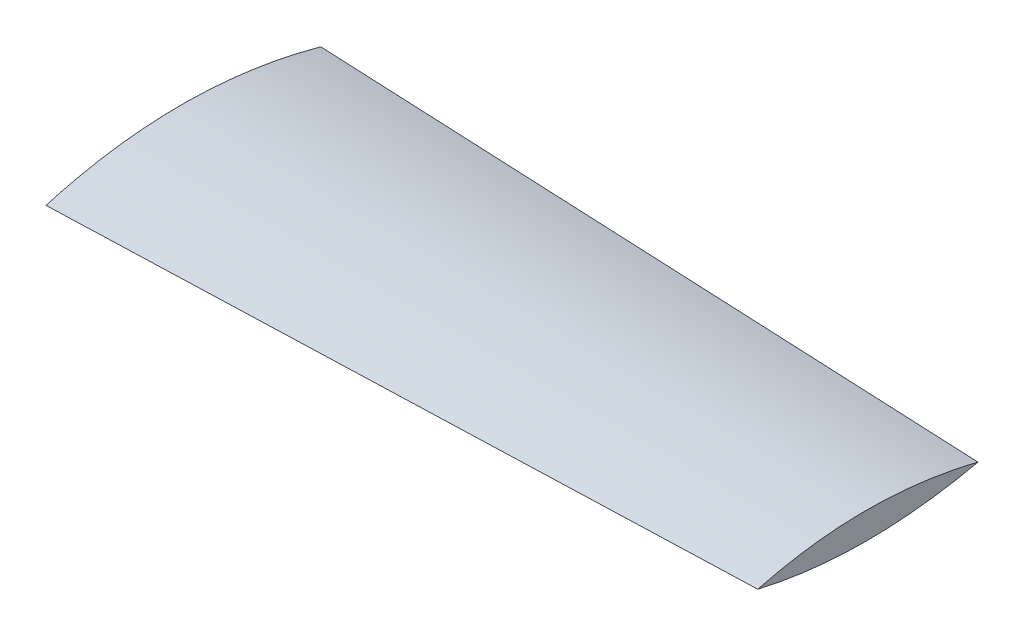
ISO-10303-21;
HEADER;
FILE_DESCRIPTION(('STEP AP214'),'2;1');
FILE_NAME('part.step','',(''),(''),'','','');
FILE_SCHEMA(('AUTOMOTIVE_DESIGN { 1 0 10303 214 1 1 1 1 }'));
ENDSEC;
DATA;
#1=APPLICATION_CONTEXT('core data for automotive mechanical design processes');
#2=APPLICATION_PROTOCOL_DEFINITION('international standard','automotive_design',2000,#1);
#3=PRODUCT_CONTEXT('',#1,'mechanical');
#4=PRODUCT('Part','Part','',(#3));
#5=PRODUCT_RELATED_PRODUCT_CATEGORY('part','',(#4));
#6=PRODUCT_DEFINITION_FORMATION('','',#4);
#7=PRODUCT_DEFINITION_CONTEXT('part definition',#1,'design');
#8=PRODUCT_DEFINITION('design','',#6,#7);
#9=PRODUCT_DEFINITION_SHAPE('','',#8);
#10=(LENGTH_UNIT() NAMED_UNIT(*) SI_UNIT(.MILLI.,.METRE.));
#11=(NAMED_UNIT(*) PLANE_ANGLE_UNIT() SI_UNIT($,.RADIAN.));
#12=(NAMED_UNIT(*) SI_UNIT($,.STERADIAN.) SOLID_ANGLE_UNIT());
#13=UNCERTAINTY_MEASURE_WITH_UNIT(LENGTH_MEASURE(1.E-05),#10,'distance_accuracy_value','');
#14=(GEOMETRIC_REPRESENTATION_CONTEXT(3) GLOBAL_UNCERTAINTY_ASSIGNED_CONTEXT((#13)) GLOBAL_UNIT_ASSIGNED_CONTEXT((#10,
#11,#12)) REPRESENTATION_CONTEXT('',''));
#15=CARTESIAN_POINT('',(0.,0.,0.));
#16=DIRECTION('',(0.,0.,1.));
#17=DIRECTION('',(1.,0.,0.));
#18=AXIS2_PLACEMENT_3D('',#15,#16,#17);
#19=CARTESIAN_POINT('',(1000.,-22.7603467550765,-197.197450937078));
#20=DIRECTION('',(1.,0.,0.));
#21=DIRECTION('',(0.,0.,-1.));
#22=AXIS2_PLACEMENT_3D('',#19,#20,#21);
#23=PLANE('',#22);
#24=CARTESIAN_POINT('',(1000.,-4.43934005814455,-359.983399597863));
#25=CARTESIAN_POINT('',(1000.,-10.2095415742377,-334.020156586738));
#26=CARTESIAN_POINT('',(999.999999999996,-18.0512424586844,-288.297216418968));
#27=CARTESIAN_POINT('',(1000.,-23.3118582215443,-220.04742638149));
#28=CARTESIAN_POINT('',(999.999999999997,-22.6155213083803,-156.729575270878));
#29=CARTESIAN_POINT('',(1000.,-16.1261942624423,-95.306637307436));
#30=CARTESIAN_POINT('',(1000.,-8.58432412918036,-56.3689985003681));
#31=CARTESIAN_POINT('',(1000.,-4.43934005814499,-38.669051193568));
#32=B_SPLINE_CURVE_WITH_KNOTS('',3,(#24,#25,#26,#27,#28,#29,#30,#31),.UNSPECIFIED.,.F.,.F.,(4,1,
1,1,1,4),(0.,0.246205292111023,0.428863988885222,0.633138489234637,0.831719124985111,1.),.UNSPECIFIED.);
#33=CARTESIAN_POINT('',(1000.,-4.43934005814455,-359.983399597863));
#34=VERTEX_POINT('',#33);
#35=CARTESIAN_POINT('',(1000.,-4.43934005814499,-38.669051193568));
#36=VERTEX_POINT('',#35);
#37=EDGE_CURVE('E53',#34,#36,#32,.T.);
#38=ORIENTED_EDGE('',*,*,#37,.F.);
#39=CARTESIAN_POINT('',(1000.,-4.43934005814499,-38.669051193568));
#40=CARTESIAN_POINT('',(1000.,-2.72078785049368,-45.1513828552471));
#41=CARTESIAN_POINT('',(1000.,0.514314222663021,-58.1905873079576));
#42=CARTESIAN_POINT('',(1000.,6.1089913161036,-84.3119445996015));
#43=CARTESIAN_POINT('',(1000.,11.4924102091961,-117.162942866881));
#44=CARTESIAN_POINT('',(1000.,15.3677881187417,-156.869596824495));
#45=CARTESIAN_POINT('',(1000.,16.6613079041053,-196.87526727396));
#46=CARTESIAN_POINT('',(1000.,15.3717710728603,-237.180968064036));
#47=CARTESIAN_POINT('',(1000.,12.1439020881745,-271.022139319429));
#48=CARTESIAN_POINT('',(1000.,8.26865077035763,-298.248816147912));
#49=CARTESIAN_POINT('',(1000.,4.71587500819476,-318.744467378411));
#50=CARTESIAN_POINT('',(1000.,1.2151006018141,-335.892621000773));
#51=CARTESIAN_POINT('',(1000.,-1.90680603868526,-349.640615522952));
#52=CARTESIAN_POINT('',(1000.,-3.57985116147015,-356.544350336995));
#53=CARTESIAN_POINT('',(1000.,-4.43934005814455,-359.983399597863));
#54=B_SPLINE_CURVE_WITH_KNOTS('',3,(#39,#40,#41,#42,#43,#44,#45,#46,#47,#48,#49,#50,#51,#52,
#53),.UNSPECIFIED.,.F.,.F.,(4,1,1,1,1,1,1,1,1,1,1,1,4),(0.,0.0624999999999999,0.125,0.25,0.375,
0.5,0.625,0.75,0.8125,0.875,0.9375,0.96875,1.),.UNSPECIFIED.);
#55=EDGE_CURVE('E11',#34,#36,#54,.F.);
#56=ORIENTED_EDGE('',*,*,#55,.T.);
#57=EDGE_LOOP('',(#38,#56));
#58=FACE_BOUND('',#57,.T.);
#59=ADVANCED_FACE('F43',(#58),#23,.T.);
#60=CARTESIAN_POINT('',(0.,-28.3210072327456,-197.219762129572));
#61=DIRECTION('',(-1.,0.,0.));
#62=DIRECTION('',(0.,0.,1.));
#63=AXIS2_PLACEMENT_3D('',#60,#61,#62);
#64=PLANE('',#63);
#65=CARTESIAN_POINT('',(0.,0.,0.));
#66=CARTESIAN_POINT('',(0.,-6.35451183790592,-21.763606217094));
#67=CARTESIAN_POINT('',(0.,-17.8764693579445,-69.4750191903004));
#68=CARTESIAN_POINT('',(0.,-27.9019897463879,-144.654228659188));
#69=CARTESIAN_POINT('',(0.,-29.2728514340721,-222.740649413469));
#70=CARTESIAN_POINT('',(0.,-21.504355930915,-308.232291240856));
#71=CARTESIAN_POINT('',(0.,-9.29704247815537,-366.932250101236));
#72=CARTESIAN_POINT('',(0.,0.,-400.891889279276));
#73=B_SPLINE_CURVE_WITH_KNOTS('',3,(#65,#66,#67,#68,#69,#70,#71,#72),.UNSPECIFIED.,.F.,.F.,(4,1,
1,1,1,4),(0.,0.168280875014889,0.366861510765363,0.571136011114778,0.753794707888977,1.),.UNSPECIFIED.);
#74=CARTESIAN_POINT('',(0.,0.,0.));
#75=VERTEX_POINT('',#74);
#76=CARTESIAN_POINT('',(0.,0.,-400.891889279276));
#77=VERTEX_POINT('',#76);
#78=EDGE_CURVE('E78',#75,#77,#73,.T.);
#79=ORIENTED_EDGE('',*,*,#78,.F.);
#80=CARTESIAN_POINT('',(0.,0.,-400.891889279276));
#81=CARTESIAN_POINT('',(0.,1.18004196803107,-396.581507828031));
#82=CARTESIAN_POINT('',(0.,3.46637328109126,-387.969146442494));
#83=CARTESIAN_POINT('',(0.,7.74402541520389,-370.778029739233));
#84=CARTESIAN_POINT('',(0.,12.5379459103301,-349.352145237306));
#85=CARTESIAN_POINT('',(0.,17.4056190284583,-323.741902038434));
#86=CARTESIAN_POINT('',(0.,22.7158078845981,-289.729335377857));
#87=CARTESIAN_POINT('',(0.,27.1409652647146,-247.465672560734));
#88=CARTESIAN_POINT('',(0.,28.9110282167612,-197.152549993946));
#89=CARTESIAN_POINT('',(0.,27.1409652647146,-147.242700240915));
#90=CARTESIAN_POINT('',(0.,21.8307764085748,-97.7361233016431));
#91=CARTESIAN_POINT('',(0.,14.4555141083806,-56.8167031970482));
#92=CARTESIAN_POINT('',(0.,6.78524131617864,-24.2828035202514));
#93=CARTESIAN_POINT('',(0.,2.36008393606213,-8.0830658174794));
#94=CARTESIAN_POINT('',(0.,0.,0.));
#95=B_SPLINE_CURVE_WITH_KNOTS('',3,(#80,#81,#82,#83,#84,#85,#86,#87,#88,#89,#90,#91,#92,#93,
#94),.UNSPECIFIED.,.F.,.F.,(4,1,1,1,1,1,1,1,1,1,1,1,4),(0.,0.03125,0.0624999999999999,0.125,
0.1875,0.25,0.375,0.5,0.625,0.75,0.875,0.9375,1.),.UNSPECIFIED.);
#96=EDGE_CURVE('E85',#77,#75,#95,.T.);
#97=ORIENTED_EDGE('',*,*,#96,.F.);
#98=EDGE_LOOP('',(#79,#97));
#99=FACE_BOUND('',#98,.T.);
#100=ADVANCED_FACE('F94',(#99),#64,.T.);
#101=CARTESIAN_POINT('',(0.,0.,-400.891889279276));
#102=CARTESIAN_POINT('',(1000.,-4.43934005814455,-359.983399597863));
#103=CARTESIAN_POINT('',(0.,1.18004196803107,-396.581507828031));
#104=CARTESIAN_POINT('',(1000.,-3.57985116147015,-356.544350336995));
#105=CARTESIAN_POINT('',(0.,3.46637328109126,-387.969146442494));
#106=CARTESIAN_POINT('',(1000.,-1.90680603868526,-349.640615522952));
#107=CARTESIAN_POINT('',(0.,7.74402541520389,-370.778029739233));
#108=CARTESIAN_POINT('',(1000.,1.2151006018141,-335.892621000773));
#109=CARTESIAN_POINT('',(0.,12.5379459103301,-349.352145237306));
#110=CARTESIAN_POINT('',(1000.,4.71587500819476,-318.744467378411));
#111=CARTESIAN_POINT('',(0.,17.4056190284583,-323.741902038434));
#112=CARTESIAN_POINT('',(1000.,8.26865077035763,-298.248816147912));
#113=CARTESIAN_POINT('',(0.,22.7158078845981,-289.729335377857));
#114=CARTESIAN_POINT('',(1000.,12.1439020881745,-271.022139319429));
#115=CARTESIAN_POINT('',(0.,27.1409652647146,-247.465672560734));
#116=CARTESIAN_POINT('',(1000.,15.3717710728603,-237.180968064036));
#117=CARTESIAN_POINT('',(0.,28.9110282167612,-197.152549993946));
#118=CARTESIAN_POINT('',(1000.,16.6613079041053,-196.87526727396));
#119=CARTESIAN_POINT('',(0.,27.1409652647146,-147.242700240915));
#120=CARTESIAN_POINT('',(1000.,15.3677881187417,-156.869596824495));
#121=CARTESIAN_POINT('',(0.,21.8307764085748,-97.7361233016431));
#122=CARTESIAN_POINT('',(1000.,11.4924102091961,-117.162942866881));
#123=CARTESIAN_POINT('',(0.,14.4555141083806,-56.8167031970482));
#124=CARTESIAN_POINT('',(1000.,6.1089913161036,-84.3119445996015));
#125=CARTESIAN_POINT('',(0.,6.78524131617864,-24.2828035202514));
#126=CARTESIAN_POINT('',(1000.,0.514314222663021,-58.1905873079576));
#127=CARTESIAN_POINT('',(0.,2.36008393606213,-8.0830658174794));
#128=CARTESIAN_POINT('',(1000.,-2.72078785049368,-45.1513828552471));
#129=CARTESIAN_POINT('',(0.,0.,0.));
#130=CARTESIAN_POINT('',(1000.,-4.43934005814499,-38.669051193568));
#131=B_SPLINE_SURFACE_WITH_KNOTS('',3,1,((#101,#102),(#103,#104),(#105,#106),(#107,#108),(#109,
#110),(#111,#112),(#113,#114),(#115,#116),(#117,#118),(#119,#120),(#121,#122),(#123,#124),(#125,
#126),(#127,#128),(#129,#130)),.UNSPECIFIED.,.F.,.F.,.F.,(4,1,1,1,1,1,1,1,1,1,1,1,4),(2,2),(0.,
0.03125,0.0624999999999999,0.125,0.1875,0.25,0.375,0.5,0.625,0.75,0.875,0.9375,1.),(0.,1.),.UNSPECIFIED.);
#132=CARTESIAN_POINT('',(0.,0.,0.));
#133=CARTESIAN_POINT('',(1000.,-4.43934005814499,-38.669051193568));
#134=B_SPLINE_CURVE_WITH_KNOTS('',1,(#132,#133),.UNSPECIFIED.,.F.,.F.,(2,2),(0.,1.),.UNSPECIFIED.);
#135=EDGE_CURVE('E73',#75,#36,#134,.T.);
#136=CARTESIAN_POINT('',(1000.,-4.43934005814455,-359.983399597863));
#137=CARTESIAN_POINT('',(0.,0.,-400.891889279276));
#138=B_SPLINE_CURVE_WITH_KNOTS('',1,(#136,#137),.UNSPECIFIED.,.F.,.F.,(2,2),(0.,1.),.UNSPECIFIED.);
#139=EDGE_CURVE('E60',#34,#77,#138,.T.);
#140=ORIENTED_EDGE('',*,*,#96,.T.);
#141=ORIENTED_EDGE('',*,*,#135,.T.);
#142=ORIENTED_EDGE('',*,*,#55,.F.);
#143=ORIENTED_EDGE('',*,*,#139,.T.);
#144=EDGE_LOOP('',(#140,#141,#142,#143));
#145=FACE_BOUND('',#144,.T.);
#146=ADVANCED_FACE('F87',(#145),#131,.T.);
#147=CARTESIAN_POINT('',(0.,0.,0.));
#148=CARTESIAN_POINT('',(1000.,-4.43934005814499,-38.669051193568));
#149=CARTESIAN_POINT('',(0.,-6.35451183790592,-21.763606217094));
#150=CARTESIAN_POINT('',(1000.,-8.58432412918036,-56.3689985003681));
#151=CARTESIAN_POINT('',(0.,-17.8764693579445,-69.4750191903004));
#152=CARTESIAN_POINT('',(1000.,-16.1261942624423,-95.306637307436));
#153=CARTESIAN_POINT('',(0.,-27.9019897463879,-144.654228659188));
#154=CARTESIAN_POINT('',(999.999999999997,-22.6155213083803,-156.729575270878));
#155=CARTESIAN_POINT('',(0.,-29.2728514340721,-222.740649413469));
#156=CARTESIAN_POINT('',(1000.,-23.3118582215443,-220.04742638149));
#157=CARTESIAN_POINT('',(0.,-21.504355930915,-308.232291240856));
#158=CARTESIAN_POINT('',(999.999999999996,-18.0512424586844,-288.297216418968));
#159=CARTESIAN_POINT('',(0.,-9.29704247815537,-366.932250101236));
#160=CARTESIAN_POINT('',(1000.,-10.2095415742377,-334.020156586738));
#161=CARTESIAN_POINT('',(0.,0.,-400.891889279276));
#162=CARTESIAN_POINT('',(1000.,-4.43934005814455,-359.983399597863));
#163=B_SPLINE_SURFACE_WITH_KNOTS('',3,1,((#147,#148),(#149,#150),(#151,#152),(#153,#154),(#155,
#156),(#157,#158),(#159,#160),(#161,#162)),.UNSPECIFIED.,.F.,.F.,.F.,(4,1,1,1,1,4),(2,2),(0.,
0.168280875014889,0.366861510765363,0.571136011114778,0.753794707888977,1.),(0.,1.),.UNSPECIFIED.);
#164=ORIENTED_EDGE('',*,*,#78,.T.);
#165=ORIENTED_EDGE('',*,*,#139,.F.);
#166=ORIENTED_EDGE('',*,*,#37,.T.);
#167=ORIENTED_EDGE('',*,*,#135,.F.);
#168=EDGE_LOOP('',(#164,#165,#166,#167));
#169=FACE_BOUND('',#168,.T.);
#170=ADVANCED_FACE('F76',(#169),#163,.T.);
#171=CLOSED_SHELL('',(#59,#100,#146,#170));
#172=MANIFOLD_SOLID_BREP('B2',#171);
#173=ADVANCED_BREP_SHAPE_REPRESENTATION('',(#18,#172),#14);
#174=SHAPE_DEFINITION_REPRESENTATION(#9,#173);
ENDSEC;
END-ISO-10303-21;
